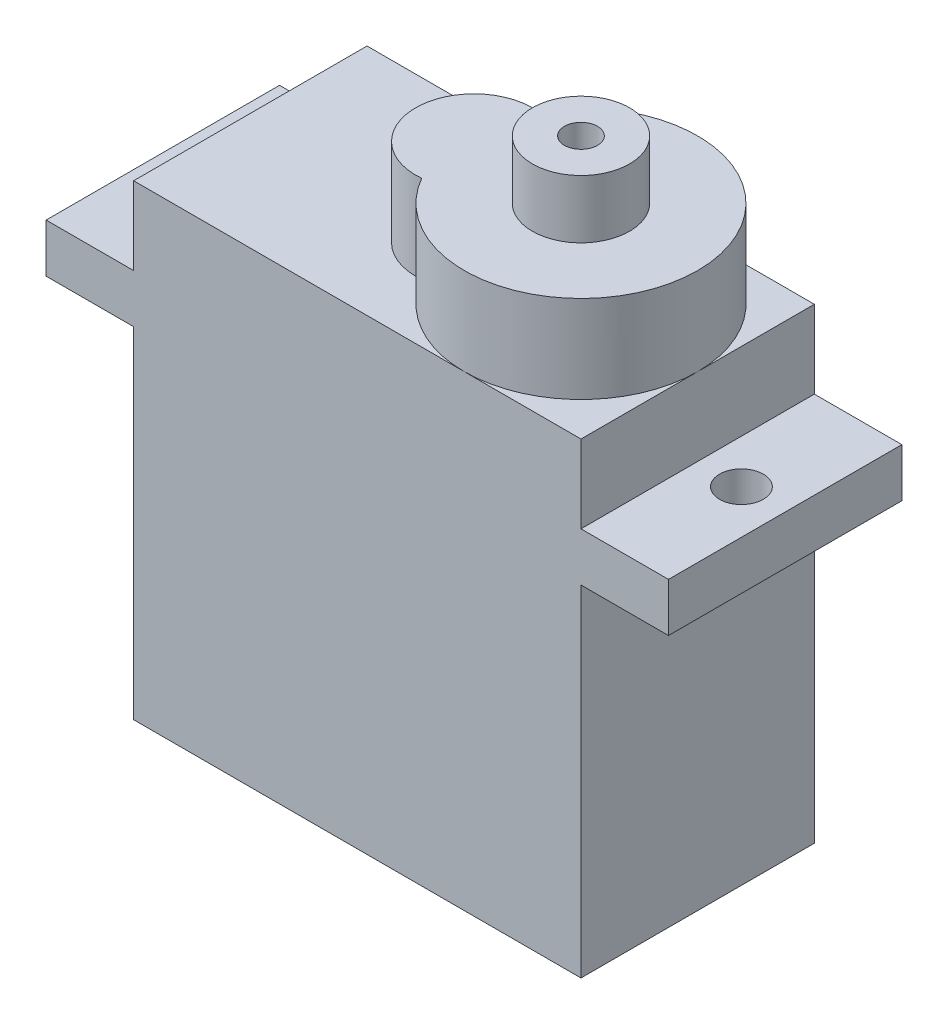
ISO-10303-21;
HEADER;
FILE_DESCRIPTION(('STEP AP214'),'2;1');
FILE_NAME('part.step','',(''),(''),'','','');
FILE_SCHEMA(('AUTOMOTIVE_DESIGN { 1 0 10303 214 1 1 1 1 }'));
ENDSEC;
DATA;
#1=APPLICATION_CONTEXT('core data for automotive mechanical design processes');
#2=APPLICATION_PROTOCOL_DEFINITION('international standard','automotive_design',2000,#1);
#3=PRODUCT_CONTEXT('',#1,'mechanical');
#4=PRODUCT('Part','Part','',(#3));
#5=PRODUCT_RELATED_PRODUCT_CATEGORY('part','',(#4));
#6=PRODUCT_DEFINITION_FORMATION('','',#4);
#7=PRODUCT_DEFINITION_CONTEXT('part definition',#1,'design');
#8=PRODUCT_DEFINITION('design','',#6,#7);
#9=PRODUCT_DEFINITION_SHAPE('','',#8);
#10=(LENGTH_UNIT() NAMED_UNIT(*) SI_UNIT(.MILLI.,.METRE.));
#11=(NAMED_UNIT(*) PLANE_ANGLE_UNIT() SI_UNIT($,.RADIAN.));
#12=(NAMED_UNIT(*) SI_UNIT($,.STERADIAN.) SOLID_ANGLE_UNIT());
#13=UNCERTAINTY_MEASURE_WITH_UNIT(LENGTH_MEASURE(1.E-05),#10,'distance_accuracy_value','');
#14=(GEOMETRIC_REPRESENTATION_CONTEXT(3) GLOBAL_UNCERTAINTY_ASSIGNED_CONTEXT((#13)) GLOBAL_UNIT_ASSIGNED_CONTEXT((#10,
#11,#12)) REPRESENTATION_CONTEXT('',''));
#15=CARTESIAN_POINT('',(0.,0.,0.));
#16=DIRECTION('',(0.,0.,1.));
#17=DIRECTION('',(1.,0.,0.));
#18=AXIS2_PLACEMENT_3D('',#15,#16,#17);
#19=CARTESIAN_POINT('',(-11.5,24.,-6.));
#20=DIRECTION('',(1.,0.,0.));
#21=DIRECTION('',(0.,0.,-1.));
#22=AXIS2_PLACEMENT_3D('',#19,#20,#21);
#23=PLANE('',#22);
#24=DIRECTION('',(0.,0.,-1.));
#25=VECTOR('',#24,1.);
#26=CARTESIAN_POINT('',(-11.5,20.,-6.));
#27=LINE('',#26,#25);
#28=CARTESIAN_POINT('',(-11.5,20.,6.));
#29=VERTEX_POINT('',#28);
#30=CARTESIAN_POINT('',(-11.5,20.,-6.));
#31=VERTEX_POINT('',#30);
#32=EDGE_CURVE('E180',#29,#31,#27,.T.);
#33=ORIENTED_EDGE('',*,*,#32,.F.);
#34=DIRECTION('',(0.,-1.,0.));
#35=VECTOR('',#34,1.);
#36=CARTESIAN_POINT('',(-11.5,24.,6.));
#37=LINE('',#36,#35);
#38=CARTESIAN_POINT('',(-11.5,24.,6.));
#39=VERTEX_POINT('',#38);
#40=EDGE_CURVE('E43',#39,#29,#37,.T.);
#41=ORIENTED_EDGE('',*,*,#40,.F.);
#42=DIRECTION('',(0.,0.,1.));
#43=VECTOR('',#42,1.);
#44=CARTESIAN_POINT('',(-11.5,24.,-6.));
#45=LINE('',#44,#43);
#46=CARTESIAN_POINT('',(-11.5,24.,-6.));
#47=VERTEX_POINT('',#46);
#48=EDGE_CURVE('E247',#47,#39,#45,.T.);
#49=ORIENTED_EDGE('',*,*,#48,.F.);
#50=DIRECTION('',(0.,-1.,0.));
#51=VECTOR('',#50,1.);
#52=CARTESIAN_POINT('',(-11.5,24.,-6.));
#53=LINE('',#52,#51);
#54=EDGE_CURVE('E271',#47,#31,#53,.T.);
#55=ORIENTED_EDGE('',*,*,#54,.T.);
#56=EDGE_LOOP('',(#33,#41,#49,#55));
#57=FACE_BOUND('',#56,.T.);
#58=ADVANCED_FACE('F39',(#57),#23,.F.);
#59=CARTESIAN_POINT('',(11.5,24.,-6.));
#60=DIRECTION('',(-1.,0.,0.));
#61=DIRECTION('',(0.,0.,1.));
#62=AXIS2_PLACEMENT_3D('',#59,#60,#61);
#63=PLANE('',#62);
#64=DIRECTION('',(0.,0.,1.));
#65=VECTOR('',#64,1.);
#66=CARTESIAN_POINT('',(11.5,20.,-6.));
#67=LINE('',#66,#65);
#68=CARTESIAN_POINT('',(11.5,20.,-6.));
#69=VERTEX_POINT('',#68);
#70=CARTESIAN_POINT('',(11.5,20.,6.));
#71=VERTEX_POINT('',#70);
#72=EDGE_CURVE('E199',#69,#71,#67,.T.);
#73=ORIENTED_EDGE('',*,*,#72,.F.);
#74=DIRECTION('',(0.,-1.,0.));
#75=VECTOR('',#74,1.);
#76=CARTESIAN_POINT('',(11.5,24.,-6.));
#77=LINE('',#76,#75);
#78=CARTESIAN_POINT('',(11.5,24.,-6.));
#79=VERTEX_POINT('',#78);
#80=EDGE_CURVE('E274',#79,#69,#77,.T.);
#81=ORIENTED_EDGE('',*,*,#80,.F.);
#82=DIRECTION('',(0.,0.,-1.));
#83=VECTOR('',#82,1.);
#84=CARTESIAN_POINT('',(11.5,24.,-6.));
#85=LINE('',#84,#83);
#86=CARTESIAN_POINT('',(11.5,24.,0.));
#87=VERTEX_POINT('',#86);
#88=EDGE_CURVE('E255',#87,#79,#85,.T.);
#89=ORIENTED_EDGE('',*,*,#88,.F.);
#90=CARTESIAN_POINT('',(11.5,24.,6.));
#91=VERTEX_POINT('',#90);
#92=EDGE_CURVE('E254',#91,#87,#85,.T.);
#93=ORIENTED_EDGE('',*,*,#92,.F.);
#94=DIRECTION('',(0.,-1.,0.));
#95=VECTOR('',#94,1.);
#96=CARTESIAN_POINT('',(11.5,24.,6.));
#97=LINE('',#96,#95);
#98=EDGE_CURVE('E279',#91,#71,#97,.T.);
#99=ORIENTED_EDGE('',*,*,#98,.T.);
#100=EDGE_LOOP('',(#73,#81,#89,#93,#99));
#101=FACE_BOUND('',#100,.T.);
#102=ADVANCED_FACE('F307',(#101),#63,.F.);
#103=CARTESIAN_POINT('',(0.,24.,0.));
#104=DIRECTION('',(0.,-1.,0.));
#105=DIRECTION('',(0.,0.,-1.));
#106=AXIS2_PLACEMENT_3D('',#103,#104,#105);
#107=PLANE('',#106);
#108=CARTESIAN_POINT('',(5.5,24.,0.));
#109=DIRECTION('',(0.,1.,0.));
#110=DIRECTION('',(0.,0.,1.));
#111=AXIS2_PLACEMENT_3D('',#108,#109,#110);
#112=CIRCLE('',#111,6.);
#113=CARTESIAN_POINT('',(0.295454545454539,24.,2.98541565139099));
#114=VERTEX_POINT('',#113);
#115=CARTESIAN_POINT('',(5.5,24.,6.));
#116=VERTEX_POINT('',#115);
#117=EDGE_CURVE('E229',#114,#116,#112,.T.);
#118=ORIENTED_EDGE('',*,*,#117,.F.);
#119=CARTESIAN_POINT('',(0.,24.,0.));
#120=DIRECTION('',(0.,1.,0.));
#121=DIRECTION('',(0.,0.,1.));
#122=AXIS2_PLACEMENT_3D('',#119,#120,#121);
#123=CIRCLE('',#122,3.);
#124=CARTESIAN_POINT('',(0.29545454545454,24.,-2.98541565139099));
#125=VERTEX_POINT('',#124);
#126=EDGE_CURVE('E234',#125,#114,#123,.T.);
#127=ORIENTED_EDGE('',*,*,#126,.F.);
#128=CARTESIAN_POINT('',(5.5,24.,-6.));
#129=VERTEX_POINT('',#128);
#130=EDGE_CURVE('E240',#129,#125,#112,.T.);
#131=ORIENTED_EDGE('',*,*,#130,.F.);
#132=DIRECTION('',(-1.,0.,0.));
#133=VECTOR('',#132,1.);
#134=CARTESIAN_POINT('',(11.5,24.,-6.));
#135=LINE('',#134,#133);
#136=EDGE_CURVE('E256',#129,#47,#135,.T.);
#137=ORIENTED_EDGE('',*,*,#136,.T.);
#138=ORIENTED_EDGE('',*,*,#48,.T.);
#139=DIRECTION('',(1.,0.,0.));
#140=VECTOR('',#139,1.);
#141=CARTESIAN_POINT('',(11.5,24.,6.));
#142=LINE('',#141,#140);
#143=EDGE_CURVE('E253',#39,#116,#142,.T.);
#144=ORIENTED_EDGE('',*,*,#143,.T.);
#145=EDGE_LOOP('',(#118,#127,#131,#137,#138,#144));
#146=FACE_BOUND('',#145,.T.);
#147=ADVANCED_FACE('F349',(#146),#107,.F.);
#148=EDGE_CURVE('E48',#116,#87,#112,.T.);
#149=ORIENTED_EDGE('',*,*,#148,.F.);
#150=EDGE_CURVE('E246',#116,#91,#142,.T.);
#151=ORIENTED_EDGE('',*,*,#150,.T.);
#152=ORIENTED_EDGE('',*,*,#92,.T.);
#153=EDGE_LOOP('',(#149,#151,#152));
#154=FACE_BOUND('',#153,.T.);
#155=ADVANCED_FACE('F351',(#154),#107,.F.);
#156=CARTESIAN_POINT('',(-11.5,17.5,6.));
#157=VERTEX_POINT('',#156);
#158=CARTESIAN_POINT('',(-11.5,0.,6.));
#159=VERTEX_POINT('',#158);
#160=EDGE_CURVE('E278',#157,#159,#37,.T.);
#161=ORIENTED_EDGE('',*,*,#160,.F.);
#162=DIRECTION('',(0.,0.,-1.));
#163=VECTOR('',#162,1.);
#164=CARTESIAN_POINT('',(-11.5,17.5,-6.));
#165=LINE('',#164,#163);
#166=CARTESIAN_POINT('',(-11.5,17.5,-6.));
#167=VERTEX_POINT('',#166);
#168=EDGE_CURVE('E174',#157,#167,#165,.T.);
#169=ORIENTED_EDGE('',*,*,#168,.T.);
#170=CARTESIAN_POINT('',(-11.5,0.,-6.));
#171=VERTEX_POINT('',#170);
#172=EDGE_CURVE('E168',#167,#171,#53,.T.);
#173=ORIENTED_EDGE('',*,*,#172,.T.);
#174=DIRECTION('',(0.,0.,1.));
#175=VECTOR('',#174,1.);
#176=CARTESIAN_POINT('',(-11.5,0.,-6.));
#177=LINE('',#176,#175);
#178=EDGE_CURVE('E242',#171,#159,#177,.T.);
#179=ORIENTED_EDGE('',*,*,#178,.T.);
#180=EDGE_LOOP('',(#161,#169,#173,#179));
#181=FACE_BOUND('',#180,.T.);
#182=ADVANCED_FACE('F41',(#181),#23,.F.);
#183=CARTESIAN_POINT('',(11.5,24.,6.));
#184=DIRECTION('',(0.,0.,-1.));
#185=DIRECTION('',(-1.,0.,0.));
#186=AXIS2_PLACEMENT_3D('',#183,#184,#185);
#187=PLANE('',#186);
#188=DIRECTION('',(1.,0.,0.));
#189=VECTOR('',#188,1.);
#190=CARTESIAN_POINT('',(11.5,0.,6.));
#191=LINE('',#190,#189);
#192=CARTESIAN_POINT('',(11.5,0.,6.));
#193=VERTEX_POINT('',#192);
#194=EDGE_CURVE('E262',#159,#193,#191,.T.);
#195=ORIENTED_EDGE('',*,*,#194,.T.);
#196=CARTESIAN_POINT('',(11.5,17.5,6.));
#197=VERTEX_POINT('',#196);
#198=EDGE_CURVE('E280',#197,#193,#97,.T.);
#199=ORIENTED_EDGE('',*,*,#198,.F.);
#200=DIRECTION('',(1.,0.,0.));
#201=VECTOR('',#200,1.);
#202=CARTESIAN_POINT('',(11.5,17.5,6.));
#203=LINE('',#202,#201);
#204=CARTESIAN_POINT('',(16.,17.5,6.));
#205=VERTEX_POINT('',#204);
#206=EDGE_CURVE('E57',#197,#205,#203,.T.);
#207=ORIENTED_EDGE('',*,*,#206,.T.);
#208=DIRECTION('',(0.,1.,0.));
#209=VECTOR('',#208,1.);
#210=CARTESIAN_POINT('',(16.,17.5,6.));
#211=LINE('',#210,#209);
#212=CARTESIAN_POINT('',(16.,20.,6.));
#213=VERTEX_POINT('',#212);
#214=EDGE_CURVE('E190',#205,#213,#211,.T.);
#215=ORIENTED_EDGE('',*,*,#214,.T.);
#216=DIRECTION('',(1.,0.,0.));
#217=VECTOR('',#216,1.);
#218=CARTESIAN_POINT('',(11.5,20.,6.));
#219=LINE('',#218,#217);
#220=EDGE_CURVE('E198',#71,#213,#219,.T.);
#221=ORIENTED_EDGE('',*,*,#220,.F.);
#222=ORIENTED_EDGE('',*,*,#98,.F.);
#223=ORIENTED_EDGE('',*,*,#150,.F.);
#224=ORIENTED_EDGE('',*,*,#143,.F.);
#225=ORIENTED_EDGE('',*,*,#40,.T.);
#226=DIRECTION('',(1.,0.,0.));
#227=VECTOR('',#226,1.);
#228=CARTESIAN_POINT('',(-11.5,20.,6.));
#229=LINE('',#228,#227);
#230=CARTESIAN_POINT('',(-16.,20.,6.));
#231=VERTEX_POINT('',#230);
#232=EDGE_CURVE('E175',#231,#29,#229,.T.);
#233=ORIENTED_EDGE('',*,*,#232,.F.);
#234=DIRECTION('',(0.,1.,0.));
#235=VECTOR('',#234,1.);
#236=CARTESIAN_POINT('',(-16.,17.5,6.));
#237=LINE('',#236,#235);
#238=CARTESIAN_POINT('',(-16.,17.5,6.));
#239=VERTEX_POINT('',#238);
#240=EDGE_CURVE('E161',#239,#231,#237,.T.);
#241=ORIENTED_EDGE('',*,*,#240,.F.);
#242=DIRECTION('',(1.,0.,0.));
#243=VECTOR('',#242,1.);
#244=CARTESIAN_POINT('',(-11.5,17.5,6.));
#245=LINE('',#244,#243);
#246=EDGE_CURVE('E165',#239,#157,#245,.T.);
#247=ORIENTED_EDGE('',*,*,#246,.T.);
#248=ORIENTED_EDGE('',*,*,#160,.T.);
#249=EDGE_LOOP('',(#195,#199,#207,#215,#221,#222,#223,#224,#225,#233,#241,#247,#248));
#250=FACE_BOUND('',#249,.T.);
#251=ADVANCED_FACE('F291',(#250),#187,.F.);
#252=CARTESIAN_POINT('',(11.5,17.5,-6.));
#253=VERTEX_POINT('',#252);
#254=CARTESIAN_POINT('',(11.5,0.,-6.));
#255=VERTEX_POINT('',#254);
#256=EDGE_CURVE('E273',#253,#255,#77,.T.);
#257=ORIENTED_EDGE('',*,*,#256,.F.);
#258=DIRECTION('',(0.,0.,1.));
#259=VECTOR('',#258,1.);
#260=CARTESIAN_POINT('',(11.5,17.5,-6.));
#261=LINE('',#260,#259);
#262=EDGE_CURVE('E207',#253,#197,#261,.T.);
#263=ORIENTED_EDGE('',*,*,#262,.T.);
#264=ORIENTED_EDGE('',*,*,#198,.T.);
#265=DIRECTION('',(0.,0.,-1.));
#266=VECTOR('',#265,1.);
#267=CARTESIAN_POINT('',(11.5,0.,-6.));
#268=LINE('',#267,#266);
#269=EDGE_CURVE('E270',#193,#255,#268,.T.);
#270=ORIENTED_EDGE('',*,*,#269,.T.);
#271=EDGE_LOOP('',(#257,#263,#264,#270));
#272=FACE_BOUND('',#271,.T.);
#273=ADVANCED_FACE('F290',(#272),#63,.F.);
#274=CARTESIAN_POINT('',(11.5,24.,-6.));
#275=DIRECTION('',(0.,0.,1.));
#276=DIRECTION('',(1.,0.,0.));
#277=AXIS2_PLACEMENT_3D('',#274,#275,#276);
#278=PLANE('',#277);
#279=DIRECTION('',(-1.,0.,0.));
#280=VECTOR('',#279,1.);
#281=CARTESIAN_POINT('',(11.5,0.,-6.));
#282=LINE('',#281,#280);
#283=EDGE_CURVE('E248',#255,#171,#282,.T.);
#284=ORIENTED_EDGE('',*,*,#283,.T.);
#285=ORIENTED_EDGE('',*,*,#172,.F.);
#286=DIRECTION('',(-1.,0.,0.));
#287=VECTOR('',#286,1.);
#288=CARTESIAN_POINT('',(-11.5,17.5,-6.));
#289=LINE('',#288,#287);
#290=CARTESIAN_POINT('',(-16.,17.5,-6.));
#291=VERTEX_POINT('',#290);
#292=EDGE_CURVE('E63',#167,#291,#289,.T.);
#293=ORIENTED_EDGE('',*,*,#292,.T.);
#294=DIRECTION('',(0.,1.,0.));
#295=VECTOR('',#294,1.);
#296=CARTESIAN_POINT('',(-16.,17.5,-6.));
#297=LINE('',#296,#295);
#298=CARTESIAN_POINT('',(-16.,20.,-6.));
#299=VERTEX_POINT('',#298);
#300=EDGE_CURVE('E153',#291,#299,#297,.T.);
#301=ORIENTED_EDGE('',*,*,#300,.T.);
#302=DIRECTION('',(-1.,0.,0.));
#303=VECTOR('',#302,1.);
#304=CARTESIAN_POINT('',(-11.5,20.,-6.));
#305=LINE('',#304,#303);
#306=EDGE_CURVE('E182',#31,#299,#305,.T.);
#307=ORIENTED_EDGE('',*,*,#306,.F.);
#308=ORIENTED_EDGE('',*,*,#54,.F.);
#309=ORIENTED_EDGE('',*,*,#136,.F.);
#310=EDGE_CURVE('E259',#79,#129,#135,.T.);
#311=ORIENTED_EDGE('',*,*,#310,.F.);
#312=ORIENTED_EDGE('',*,*,#80,.T.);
#313=DIRECTION('',(-1.,0.,0.));
#314=VECTOR('',#313,1.);
#315=CARTESIAN_POINT('',(11.5,20.,-6.));
#316=LINE('',#315,#314);
#317=CARTESIAN_POINT('',(16.,20.,-6.));
#318=VERTEX_POINT('',#317);
#319=EDGE_CURVE('E201',#318,#69,#316,.T.);
#320=ORIENTED_EDGE('',*,*,#319,.F.);
#321=DIRECTION('',(0.,1.,0.));
#322=VECTOR('',#321,1.);
#323=CARTESIAN_POINT('',(16.,17.5,-6.));
#324=LINE('',#323,#322);
#325=CARTESIAN_POINT('',(16.,17.5,-6.));
#326=VERTEX_POINT('',#325);
#327=EDGE_CURVE('E192',#326,#318,#324,.T.);
#328=ORIENTED_EDGE('',*,*,#327,.F.);
#329=DIRECTION('',(-1.,0.,0.));
#330=VECTOR('',#329,1.);
#331=CARTESIAN_POINT('',(11.5,17.5,-6.));
#332=LINE('',#331,#330);
#333=EDGE_CURVE('E197',#326,#253,#332,.T.);
#334=ORIENTED_EDGE('',*,*,#333,.T.);
#335=ORIENTED_EDGE('',*,*,#256,.T.);
#336=EDGE_LOOP('',(#284,#285,#293,#301,#307,#308,#309,#311,#312,#320,#328,#334,#335));
#337=FACE_BOUND('',#336,.T.);
#338=ADVANCED_FACE('F166',(#337),#278,.F.);
#339=EDGE_CURVE('E312',#87,#129,#112,.T.);
#340=ORIENTED_EDGE('',*,*,#339,.F.);
#341=ORIENTED_EDGE('',*,*,#88,.T.);
#342=ORIENTED_EDGE('',*,*,#310,.T.);
#343=EDGE_LOOP('',(#340,#341,#342));
#344=FACE_BOUND('',#343,.T.);
#345=ADVANCED_FACE('F314',(#344),#107,.F.);
#346=CARTESIAN_POINT('',(0.,0.,0.));
#347=DIRECTION('',(0.,-1.,0.));
#348=DIRECTION('',(0.,0.,-1.));
#349=AXIS2_PLACEMENT_3D('',#346,#347,#348);
#350=PLANE('',#349);
#351=ORIENTED_EDGE('',*,*,#178,.F.);
#352=ORIENTED_EDGE('',*,*,#283,.F.);
#353=ORIENTED_EDGE('',*,*,#269,.F.);
#354=ORIENTED_EDGE('',*,*,#194,.F.);
#355=EDGE_LOOP('',(#351,#352,#353,#354));
#356=FACE_BOUND('',#355,.T.);
#357=ADVANCED_FACE('F296',(#356),#350,.T.);
#358=CARTESIAN_POINT('',(5.5,28.5,0.));
#359=DIRECTION('',(0.,-1.,0.));
#360=DIRECTION('',(0.,0.,-1.));
#361=AXIS2_PLACEMENT_3D('',#358,#359,#360);
#362=CYLINDRICAL_SURFACE('',#361,6.);
#363=ORIENTED_EDGE('',*,*,#117,.T.);
#364=ORIENTED_EDGE('',*,*,#148,.T.);
#365=ORIENTED_EDGE('',*,*,#339,.T.);
#366=ORIENTED_EDGE('',*,*,#130,.T.);
#367=DIRECTION('',(0.,-1.,0.));
#368=VECTOR('',#367,1.);
#369=CARTESIAN_POINT('',(0.29545454545454,28.5,-2.98541565139099));
#370=LINE('',#369,#368);
#371=CARTESIAN_POINT('',(0.29545454545454,28.5,-2.98541565139099));
#372=VERTEX_POINT('',#371);
#373=EDGE_CURVE('E241',#372,#125,#370,.T.);
#374=ORIENTED_EDGE('',*,*,#373,.F.);
#375=CARTESIAN_POINT('',(5.5,28.5,0.));
#376=DIRECTION('',(0.,1.,0.));
#377=DIRECTION('',(0.,0.,1.));
#378=AXIS2_PLACEMENT_3D('',#375,#376,#377);
#379=CIRCLE('',#378,6.);
#380=CARTESIAN_POINT('',(0.295454545454539,28.5,2.98541565139099));
#381=VERTEX_POINT('',#380);
#382=EDGE_CURVE('E230',#381,#372,#379,.T.);
#383=ORIENTED_EDGE('',*,*,#382,.F.);
#384=DIRECTION('',(0.,-1.,0.));
#385=VECTOR('',#384,1.);
#386=CARTESIAN_POINT('',(0.295454545454539,28.5,2.98541565139099));
#387=LINE('',#386,#385);
#388=EDGE_CURVE('E231',#381,#114,#387,.T.);
#389=ORIENTED_EDGE('',*,*,#388,.T.);
#390=EDGE_LOOP('',(#363,#364,#365,#366,#374,#383,#389));
#391=FACE_BOUND('',#390,.T.);
#392=ADVANCED_FACE('F317',(#391),#362,.T.);
#393=CARTESIAN_POINT('',(0.,28.5,0.));
#394=DIRECTION('',(0.,-1.,0.));
#395=DIRECTION('',(0.,0.,-1.));
#396=AXIS2_PLACEMENT_3D('',#393,#394,#395);
#397=CYLINDRICAL_SURFACE('',#396,3.);
#398=ORIENTED_EDGE('',*,*,#126,.T.);
#399=ORIENTED_EDGE('',*,*,#388,.F.);
#400=CARTESIAN_POINT('',(0.,28.5,0.));
#401=DIRECTION('',(0.,1.,0.));
#402=DIRECTION('',(0.,0.,1.));
#403=AXIS2_PLACEMENT_3D('',#400,#401,#402);
#404=CIRCLE('',#403,3.);
#405=EDGE_CURVE('E232',#372,#381,#404,.T.);
#406=ORIENTED_EDGE('',*,*,#405,.F.);
#407=ORIENTED_EDGE('',*,*,#373,.T.);
#408=EDGE_LOOP('',(#398,#399,#406,#407));
#409=FACE_BOUND('',#408,.T.);
#410=ADVANCED_FACE('F480',(#409),#397,.T.);
#411=CARTESIAN_POINT('',(2.75,28.5,0.));
#412=DIRECTION('',(0.,1.,0.));
#413=DIRECTION('',(0.,0.,1.));
#414=AXIS2_PLACEMENT_3D('',#411,#412,#413);
#415=PLANE('',#414);
#416=CARTESIAN_POINT('',(5.5,28.5,0.));
#417=DIRECTION('',(0.,1.,0.));
#418=DIRECTION('',(0.,0.,1.));
#419=AXIS2_PLACEMENT_3D('',#416,#417,#418);
#420=CIRCLE('',#419,2.5);
#421=CARTESIAN_POINT('',(5.5,28.5,2.5));
#422=VERTEX_POINT('',#421);
#423=EDGE_CURVE('E11',#422,#422,#420,.T.);
#424=ORIENTED_EDGE('',*,*,#423,.F.);
#425=EDGE_LOOP('',(#424));
#426=FACE_BOUND('',#425,.T.);
#427=ORIENTED_EDGE('',*,*,#382,.T.);
#428=ORIENTED_EDGE('',*,*,#405,.T.);
#429=EDGE_LOOP('',(#427,#428));
#430=FACE_BOUND('',#429,.T.);
#431=ADVANCED_FACE('F471',(#426,#430),#415,.T.);
#432=CARTESIAN_POINT('',(5.5,31.5,0.));
#433=DIRECTION('',(0.,-1.,0.));
#434=DIRECTION('',(0.,0.,-1.));
#435=AXIS2_PLACEMENT_3D('',#432,#433,#434);
#436=CYLINDRICAL_SURFACE('',#435,2.5);
#437=CARTESIAN_POINT('',(5.5,31.5,0.));
#438=DIRECTION('',(0.,1.,0.));
#439=DIRECTION('',(0.,0.,1.));
#440=AXIS2_PLACEMENT_3D('',#437,#438,#439);
#441=CIRCLE('',#440,2.5);
#442=CARTESIAN_POINT('',(5.5,31.5,2.5));
#443=VERTEX_POINT('',#442);
#444=EDGE_CURVE('E225',#443,#443,#441,.T.);
#445=ORIENTED_EDGE('',*,*,#444,.F.);
#446=EDGE_LOOP('',(#445));
#447=FACE_BOUND('',#446,.T.);
#448=ORIENTED_EDGE('',*,*,#423,.T.);
#449=EDGE_LOOP('',(#448));
#450=FACE_BOUND('',#449,.T.);
#451=ADVANCED_FACE('F466',(#447,#450),#436,.T.);
#452=CARTESIAN_POINT('',(5.5,31.5,0.));
#453=DIRECTION('',(0.,1.,0.));
#454=DIRECTION('',(0.,0.,1.));
#455=AXIS2_PLACEMENT_3D('',#452,#453,#454);
#456=PLANE('',#455);
#457=CARTESIAN_POINT('',(5.5,31.5,0.));
#458=DIRECTION('',(0.,1.,0.));
#459=DIRECTION('',(0.,0.,1.));
#460=AXIS2_PLACEMENT_3D('',#457,#458,#459);
#461=CIRCLE('',#460,0.85);
#462=CARTESIAN_POINT('',(5.5,31.5,0.85));
#463=VERTEX_POINT('',#462);
#464=EDGE_CURVE('E189',#463,#463,#461,.T.);
#465=ORIENTED_EDGE('',*,*,#464,.F.);
#466=EDGE_LOOP('',(#465));
#467=FACE_BOUND('',#466,.T.);
#468=ORIENTED_EDGE('',*,*,#444,.T.);
#469=EDGE_LOOP('',(#468));
#470=FACE_BOUND('',#469,.T.);
#471=ADVANCED_FACE('F462',(#467,#470),#456,.T.);
#472=CARTESIAN_POINT('',(5.5,26.5,0.));
#473=DIRECTION('',(0.,1.,0.));
#474=DIRECTION('',(0.,0.,1.));
#475=AXIS2_PLACEMENT_3D('',#472,#473,#474);
#476=CYLINDRICAL_SURFACE('',#475,0.85);
#477=CARTESIAN_POINT('',(5.5,26.5,0.));
#478=DIRECTION('',(0.,1.,0.));
#479=DIRECTION('',(0.,0.,1.));
#480=AXIS2_PLACEMENT_3D('',#477,#478,#479);
#481=CIRCLE('',#480,0.85);
#482=CARTESIAN_POINT('',(5.5,26.5,0.85));
#483=VERTEX_POINT('',#482);
#484=EDGE_CURVE('E218',#483,#483,#481,.T.);
#485=ORIENTED_EDGE('',*,*,#484,.F.);
#486=EDGE_LOOP('',(#485));
#487=FACE_BOUND('',#486,.T.);
#488=ORIENTED_EDGE('',*,*,#464,.T.);
#489=EDGE_LOOP('',(#488));
#490=FACE_BOUND('',#489,.T.);
#491=ADVANCED_FACE('F464',(#487,#490),#476,.F.);
#492=CARTESIAN_POINT('',(5.5,26.5,0.));
#493=DIRECTION('',(0.,1.,0.));
#494=DIRECTION('',(0.,0.,1.));
#495=AXIS2_PLACEMENT_3D('',#492,#493,#494);
#496=PLANE('',#495);
#497=ORIENTED_EDGE('',*,*,#484,.T.);
#498=EDGE_LOOP('',(#497));
#499=FACE_BOUND('',#498,.T.);
#500=ADVANCED_FACE('F404',(#499),#496,.T.);
#501=CARTESIAN_POINT('',(16.,17.5,-6.));
#502=DIRECTION('',(1.,0.,0.));
#503=DIRECTION('',(0.,0.,-1.));
#504=AXIS2_PLACEMENT_3D('',#501,#502,#503);
#505=PLANE('',#504);
#506=DIRECTION('',(0.,0.,-1.));
#507=VECTOR('',#506,1.);
#508=CARTESIAN_POINT('',(16.,20.,-6.));
#509=LINE('',#508,#507);
#510=EDGE_CURVE('E195',#213,#318,#509,.T.);
#511=ORIENTED_EDGE('',*,*,#510,.F.);
#512=ORIENTED_EDGE('',*,*,#214,.F.);
#513=DIRECTION('',(0.,0.,-1.));
#514=VECTOR('',#513,1.);
#515=CARTESIAN_POINT('',(16.,17.5,-6.));
#516=LINE('',#515,#514);
#517=EDGE_CURVE('E187',#205,#326,#516,.T.);
#518=ORIENTED_EDGE('',*,*,#517,.T.);
#519=ORIENTED_EDGE('',*,*,#327,.T.);
#520=EDGE_LOOP('',(#511,#512,#518,#519));
#521=FACE_BOUND('',#520,.T.);
#522=ADVANCED_FACE('F305',(#521),#505,.T.);
#523=CARTESIAN_POINT('',(0.,17.5,0.));
#524=DIRECTION('',(0.,-1.,0.));
#525=DIRECTION('',(0.,0.,-1.));
#526=AXIS2_PLACEMENT_3D('',#523,#524,#525);
#527=PLANE('',#526);
#528=CARTESIAN_POINT('',(13.75,17.5,0.));
#529=DIRECTION('',(0.,1.,0.));
#530=DIRECTION('',(0.,0.,-1.));
#531=AXIS2_PLACEMENT_3D('',#528,#529,#530);
#532=CIRCLE('',#531,1.125);
#533=CARTESIAN_POINT('',(13.75,17.5,-1.125));
#534=VERTEX_POINT('',#533);
#535=EDGE_CURVE('E202',#534,#534,#532,.T.);
#536=ORIENTED_EDGE('',*,*,#535,.T.);
#537=EDGE_LOOP('',(#536));
#538=FACE_BOUND('',#537,.T.);
#539=ORIENTED_EDGE('',*,*,#333,.F.);
#540=ORIENTED_EDGE('',*,*,#517,.F.);
#541=ORIENTED_EDGE('',*,*,#206,.F.);
#542=ORIENTED_EDGE('',*,*,#262,.F.);
#543=EDGE_LOOP('',(#539,#540,#541,#542));
#544=FACE_BOUND('',#543,.T.);
#545=ADVANCED_FACE('F297',(#538,#544),#527,.T.);
#546=CARTESIAN_POINT('',(0.,20.,0.));
#547=DIRECTION('',(0.,-1.,0.));
#548=DIRECTION('',(0.,0.,-1.));
#549=AXIS2_PLACEMENT_3D('',#546,#547,#548);
#550=PLANE('',#549);
#551=CARTESIAN_POINT('',(13.75,20.,0.));
#552=DIRECTION('',(0.,1.,0.));
#553=DIRECTION('',(0.,0.,-1.));
#554=AXIS2_PLACEMENT_3D('',#551,#552,#553);
#555=CIRCLE('',#554,1.125);
#556=CARTESIAN_POINT('',(13.75,20.,-1.125));
#557=VERTEX_POINT('',#556);
#558=EDGE_CURVE('E213',#557,#557,#555,.T.);
#559=ORIENTED_EDGE('',*,*,#558,.F.);
#560=EDGE_LOOP('',(#559));
#561=FACE_BOUND('',#560,.T.);
#562=ORIENTED_EDGE('',*,*,#319,.T.);
#563=ORIENTED_EDGE('',*,*,#72,.T.);
#564=ORIENTED_EDGE('',*,*,#220,.T.);
#565=ORIENTED_EDGE('',*,*,#510,.T.);
#566=EDGE_LOOP('',(#562,#563,#564,#565));
#567=FACE_BOUND('',#566,.T.);
#568=ADVANCED_FACE('F303',(#561,#567),#550,.F.);
#569=CARTESIAN_POINT('',(13.75,17.5,0.));
#570=DIRECTION('',(0.,1.,0.));
#571=DIRECTION('',(0.,0.,1.));
#572=AXIS2_PLACEMENT_3D('',#569,#570,#571);
#573=CYLINDRICAL_SURFACE('',#572,1.125);
#574=ORIENTED_EDGE('',*,*,#535,.F.);
#575=EDGE_LOOP('',(#574));
#576=FACE_BOUND('',#575,.T.);
#577=ORIENTED_EDGE('',*,*,#558,.T.);
#578=EDGE_LOOP('',(#577));
#579=FACE_BOUND('',#578,.T.);
#580=ADVANCED_FACE('F421',(#576,#579),#573,.F.);
#581=CARTESIAN_POINT('',(-16.,17.5,-6.));
#582=DIRECTION('',(-1.,0.,0.));
#583=DIRECTION('',(0.,0.,1.));
#584=AXIS2_PLACEMENT_3D('',#581,#582,#583);
#585=PLANE('',#584);
#586=DIRECTION('',(0.,0.,1.));
#587=VECTOR('',#586,1.);
#588=CARTESIAN_POINT('',(-16.,20.,-6.));
#589=LINE('',#588,#587);
#590=EDGE_CURVE('E158',#299,#231,#589,.T.);
#591=ORIENTED_EDGE('',*,*,#590,.F.);
#592=ORIENTED_EDGE('',*,*,#300,.F.);
#593=DIRECTION('',(0.,0.,1.));
#594=VECTOR('',#593,1.);
#595=CARTESIAN_POINT('',(-16.,17.5,-6.));
#596=LINE('',#595,#594);
#597=EDGE_CURVE('E154',#291,#239,#596,.T.);
#598=ORIENTED_EDGE('',*,*,#597,.T.);
#599=ORIENTED_EDGE('',*,*,#240,.T.);
#600=EDGE_LOOP('',(#591,#592,#598,#599));
#601=FACE_BOUND('',#600,.T.);
#602=ADVANCED_FACE('F152',(#601),#585,.T.);
#603=CARTESIAN_POINT('',(0.,17.5,0.));
#604=DIRECTION('',(0.,-1.,0.));
#605=DIRECTION('',(0.,0.,-1.));
#606=AXIS2_PLACEMENT_3D('',#603,#604,#605);
#607=PLANE('',#606);
#608=CARTESIAN_POINT('',(-13.75,17.5,0.));
#609=DIRECTION('',(0.,1.,0.));
#610=DIRECTION('',(0.,0.,1.));
#611=AXIS2_PLACEMENT_3D('',#608,#609,#610);
#612=CIRCLE('',#611,1.125);
#613=CARTESIAN_POINT('',(-13.75,17.5,1.125));
#614=VERTEX_POINT('',#613);
#615=EDGE_CURVE('E185',#614,#614,#612,.T.);
#616=ORIENTED_EDGE('',*,*,#615,.T.);
#617=EDGE_LOOP('',(#616));
#618=FACE_BOUND('',#617,.T.);
#619=ORIENTED_EDGE('',*,*,#168,.F.);
#620=ORIENTED_EDGE('',*,*,#246,.F.);
#621=ORIENTED_EDGE('',*,*,#597,.F.);
#622=ORIENTED_EDGE('',*,*,#292,.F.);
#623=EDGE_LOOP('',(#619,#620,#621,#622));
#624=FACE_BOUND('',#623,.T.);
#625=ADVANCED_FACE('F163',(#618,#624),#607,.T.);
#626=CARTESIAN_POINT('',(0.,20.,0.));
#627=DIRECTION('',(0.,-1.,0.));
#628=DIRECTION('',(0.,0.,-1.));
#629=AXIS2_PLACEMENT_3D('',#626,#627,#628);
#630=PLANE('',#629);
#631=CARTESIAN_POINT('',(-13.75,20.,0.));
#632=DIRECTION('',(0.,1.,0.));
#633=DIRECTION('',(0.,0.,1.));
#634=AXIS2_PLACEMENT_3D('',#631,#632,#633);
#635=CIRCLE('',#634,1.125);
#636=CARTESIAN_POINT('',(-13.75,20.,1.125));
#637=VERTEX_POINT('',#636);
#638=EDGE_CURVE('E216',#637,#637,#635,.T.);
#639=ORIENTED_EDGE('',*,*,#638,.F.);
#640=EDGE_LOOP('',(#639));
#641=FACE_BOUND('',#640,.T.);
#642=ORIENTED_EDGE('',*,*,#32,.T.);
#643=ORIENTED_EDGE('',*,*,#306,.T.);
#644=ORIENTED_EDGE('',*,*,#590,.T.);
#645=ORIENTED_EDGE('',*,*,#232,.T.);
#646=EDGE_LOOP('',(#642,#643,#644,#645));
#647=FACE_BOUND('',#646,.T.);
#648=ADVANCED_FACE('F328',(#641,#647),#630,.F.);
#649=CARTESIAN_POINT('',(-13.75,17.5,0.));
#650=DIRECTION('',(0.,1.,0.));
#651=DIRECTION('',(0.,0.,1.));
#652=AXIS2_PLACEMENT_3D('',#649,#650,#651);
#653=CYLINDRICAL_SURFACE('',#652,1.125);
#654=ORIENTED_EDGE('',*,*,#615,.F.);
#655=EDGE_LOOP('',(#654));
#656=FACE_BOUND('',#655,.T.);
#657=ORIENTED_EDGE('',*,*,#638,.T.);
#658=EDGE_LOOP('',(#657));
#659=FACE_BOUND('',#658,.T.);
#660=ADVANCED_FACE('F332',(#656,#659),#653,.F.);
#661=CLOSED_SHELL('',(#58,#102,#147,#155,#182,#251,#273,#338,#345,#357,#392,#410,#431,#451,#471,
#491,#500,#522,#545,#568,#580,#602,#625,#648,#660));
#662=MANIFOLD_SOLID_BREP('B2',#661);
#663=ADVANCED_BREP_SHAPE_REPRESENTATION('',(#18,#662),#14);
#664=SHAPE_DEFINITION_REPRESENTATION(#9,#663);
ENDSEC;
END-ISO-10303-21;
